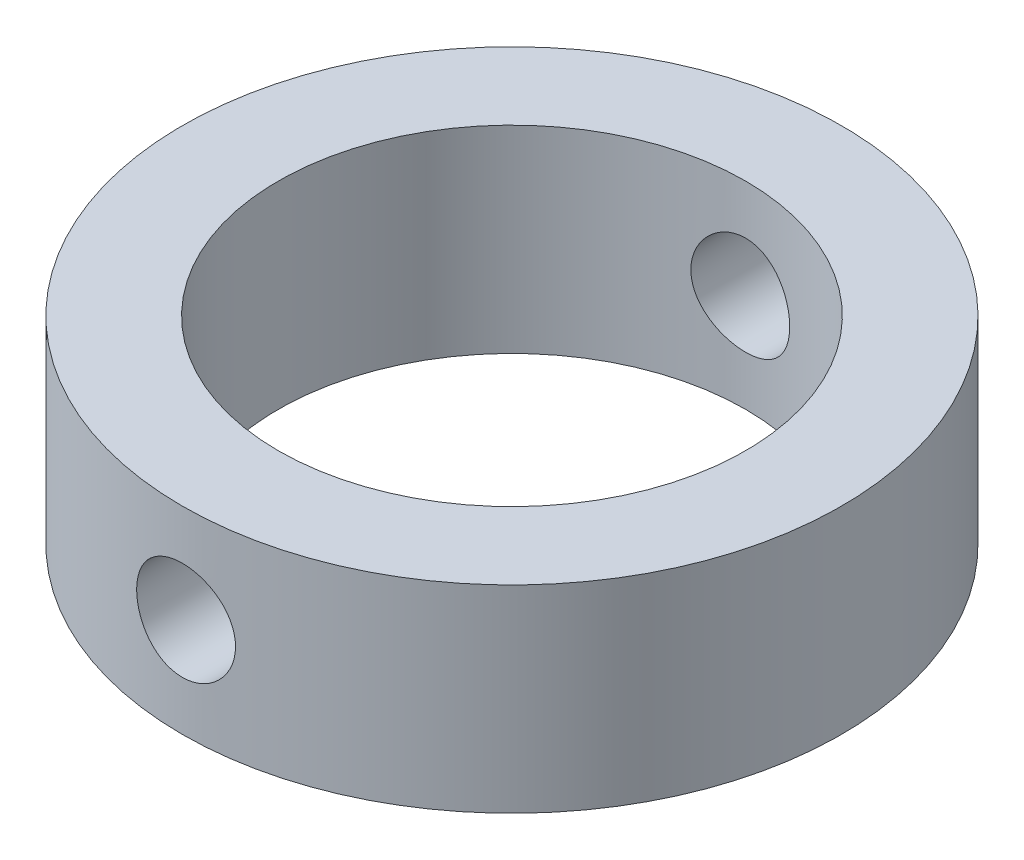
ISO-10303-21;
HEADER;
FILE_DESCRIPTION(('STEP AP214'),'2;1');
FILE_NAME('part.step','',(''),(''),'','','');
FILE_SCHEMA(('AUTOMOTIVE_DESIGN { 1 0 10303 214 1 1 1 1 }'));
ENDSEC;
DATA;
#1=APPLICATION_CONTEXT('core data for automotive mechanical design processes');
#2=APPLICATION_PROTOCOL_DEFINITION('international standard','automotive_design',2000,#1);
#3=PRODUCT_CONTEXT('',#1,'mechanical');
#4=PRODUCT('Part','Part','',(#3));
#5=PRODUCT_RELATED_PRODUCT_CATEGORY('part','',(#4));
#6=PRODUCT_DEFINITION_FORMATION('','',#4);
#7=PRODUCT_DEFINITION_CONTEXT('part definition',#1,'design');
#8=PRODUCT_DEFINITION('design','',#6,#7);
#9=PRODUCT_DEFINITION_SHAPE('','',#8);
#10=(LENGTH_UNIT() NAMED_UNIT(*) SI_UNIT(.MILLI.,.METRE.));
#11=(NAMED_UNIT(*) PLANE_ANGLE_UNIT() SI_UNIT($,.RADIAN.));
#12=(NAMED_UNIT(*) SI_UNIT($,.STERADIAN.) SOLID_ANGLE_UNIT());
#13=UNCERTAINTY_MEASURE_WITH_UNIT(LENGTH_MEASURE(1.E-05),#10,'distance_accuracy_value','');
#14=(GEOMETRIC_REPRESENTATION_CONTEXT(3) GLOBAL_UNCERTAINTY_ASSIGNED_CONTEXT((#13)) GLOBAL_UNIT_ASSIGNED_CONTEXT((#10,
#11,#12)) REPRESENTATION_CONTEXT('',''));
#15=CARTESIAN_POINT('',(0.,0.,0.));
#16=DIRECTION('',(0.,0.,1.));
#17=DIRECTION('',(1.,0.,0.));
#18=AXIS2_PLACEMENT_3D('',#15,#16,#17);
#19=CARTESIAN_POINT('',(0.,7.50000000000001,0.));
#20=DIRECTION('',(0.,1.,0.));
#21=DIRECTION('',(0.,0.,1.));
#22=AXIS2_PLACEMENT_3D('',#19,#20,#21);
#23=PLANE('',#22);
#24=CARTESIAN_POINT('',(0.,7.50000000000001,0.));
#25=DIRECTION('',(0.,1.,0.));
#26=DIRECTION('',(0.,0.,1.));
#27=AXIS2_PLACEMENT_3D('',#24,#25,#26);
#28=CIRCLE('',#27,25.);
#29=CARTESIAN_POINT('',(0.,7.50000000000001,25.));
#30=VERTEX_POINT('',#29);
#31=EDGE_CURVE('E10',#30,#30,#28,.T.);
#32=ORIENTED_EDGE('',*,*,#31,.T.);
#33=EDGE_LOOP('',(#32));
#34=FACE_BOUND('',#33,.T.);
#35=CARTESIAN_POINT('',(0.,7.50000000000001,0.));
#36=DIRECTION('',(0.,1.,0.));
#37=DIRECTION('',(0.,0.,1.));
#38=AXIS2_PLACEMENT_3D('',#35,#36,#37);
#39=CIRCLE('',#38,17.7222);
#40=CARTESIAN_POINT('',(0.,7.50000000000001,17.7222));
#41=VERTEX_POINT('',#40);
#42=EDGE_CURVE('E65',#41,#41,#39,.T.);
#43=ORIENTED_EDGE('',*,*,#42,.F.);
#44=EDGE_LOOP('',(#43));
#45=FACE_BOUND('',#44,.T.);
#46=ADVANCED_FACE('F43',(#34,#45),#23,.T.);
#47=CARTESIAN_POINT('',(0.,-7.50000000000001,0.));
#48=DIRECTION('',(0.,1.,0.));
#49=DIRECTION('',(0.,0.,1.));
#50=AXIS2_PLACEMENT_3D('',#47,#48,#49);
#51=PLANE('',#50);
#52=CARTESIAN_POINT('',(0.,-7.50000000000001,0.));
#53=DIRECTION('',(0.,1.,0.));
#54=DIRECTION('',(0.,0.,1.));
#55=AXIS2_PLACEMENT_3D('',#52,#53,#54);
#56=CIRCLE('',#55,25.);
#57=CARTESIAN_POINT('',(0.,-7.50000000000001,25.));
#58=VERTEX_POINT('',#57);
#59=EDGE_CURVE('E58',#58,#58,#56,.T.);
#60=ORIENTED_EDGE('',*,*,#59,.F.);
#61=EDGE_LOOP('',(#60));
#62=FACE_BOUND('',#61,.T.);
#63=CARTESIAN_POINT('',(0.,-7.50000000000001,0.));
#64=DIRECTION('',(0.,1.,0.));
#65=DIRECTION('',(0.,0.,1.));
#66=AXIS2_PLACEMENT_3D('',#63,#64,#65);
#67=CIRCLE('',#66,17.7222);
#68=CARTESIAN_POINT('',(0.,-7.50000000000001,17.7222));
#69=VERTEX_POINT('',#68);
#70=EDGE_CURVE('E68',#69,#69,#67,.T.);
#71=ORIENTED_EDGE('',*,*,#70,.T.);
#72=EDGE_LOOP('',(#71));
#73=FACE_BOUND('',#72,.T.);
#74=ADVANCED_FACE('F111',(#62,#73),#51,.F.);
#75=CARTESIAN_POINT('',(0.,7.50000000000001,0.));
#76=DIRECTION('',(0.,-1.,0.));
#77=DIRECTION('',(0.,0.,-1.));
#78=AXIS2_PLACEMENT_3D('',#75,#76,#77);
#79=CYLINDRICAL_SURFACE('',#78,25.);
#80=CARTESIAN_POINT('',(0.,3.74999999999998,-25.));
#81=CARTESIAN_POINT('',(-0.209378861204106,3.74999136546187,-24.9999966442824));
#82=CARTESIAN_POINT('',(-0.41887921270533,3.7324049978984,-24.997342063426));
#83=CARTESIAN_POINT('',(-0.832024069987285,3.66254200004314,-24.9870078993297));
#84=CARTESIAN_POINT('',(-1.03566267243558,3.61023159263779,-24.9793234234618));
#85=CARTESIAN_POINT('',(-1.43104521555465,3.47251873758097,-24.9597930304881));
#86=CARTESIAN_POINT('',(-1.62279801956699,3.38714130123514,-24.947950259273));
#87=CARTESIAN_POINT('',(-1.98922607158813,3.18577905145784,-24.9214118977931));
#88=CARTESIAN_POINT('',(-2.16390368681297,3.06979848895659,-24.9067167038193));
#89=CARTESIAN_POINT('',(-2.49261679890531,2.80955683765031,-24.8759792747863));
#90=CARTESIAN_POINT('',(-2.64649958056375,2.66510385947948,-24.8599283472583));
#91=CARTESIAN_POINT('',(-2.92793726672371,2.35243077776534,-24.828356528331));
#92=CARTESIAN_POINT('',(-3.0554906568234,2.18420930805372,-24.8128356674626));
#93=CARTESIAN_POINT('',(-3.28124323749857,1.8277483911938,-24.7839969364681));
#94=CARTESIAN_POINT('',(-3.37929467593011,1.63941438254668,-24.7706902993758));
#95=CARTESIAN_POINT('',(-3.54231580427639,1.24871794838645,-24.7479052826567));
#96=CARTESIAN_POINT('',(-3.60728729722907,1.04635628814029,-24.7384266943862));
#97=CARTESIAN_POINT('',(-3.70182996997278,0.634954895320726,-24.7244564054669));
#98=CARTESIAN_POINT('',(-3.73166259101294,0.425976516479948,-24.7199278935313));
#99=CARTESIAN_POINT('',(-3.75589060084831,0.00593458503179794,-24.7162587242645));
#100=CARTESIAN_POINT('',(-3.75028802434491,-0.205128847156248,-24.7171177575787));
#101=CARTESIAN_POINT('',(-3.70401833126969,-0.621502700485371,-24.7240929588102));
#102=CARTESIAN_POINT('',(-3.66364239819375,-0.826846316212019,-24.7301654690387));
#103=CARTESIAN_POINT('',(-3.54942793509335,-1.22781092217884,-24.7468152031592));
#104=CARTESIAN_POINT('',(-3.4755884584453,-1.42343163720187,-24.7573925544845));
#105=CARTESIAN_POINT('',(-3.29624008824341,-1.80028342820716,-24.781908388637));
#106=CARTESIAN_POINT('',(-3.19060785707994,-1.98145492273098,-24.7958599191632));
#107=CARTESIAN_POINT('',(-2.95076032822386,-2.32361148945484,-24.8255426893637));
#108=CARTESIAN_POINT('',(-2.81654315456195,-2.48459523567344,-24.8412740458125));
#109=CARTESIAN_POINT('',(-2.5217373269562,-2.7834941518493,-24.8729368264052));
#110=CARTESIAN_POINT('',(-2.360898324105,-2.92116247571585,-24.8888686778204));
#111=CARTESIAN_POINT('',(-2.01826772473546,-3.16758983626815,-24.9189911912115));
#112=CARTESIAN_POINT('',(-1.83647603647042,-3.27634874635974,-24.9331818455628));
#113=CARTESIAN_POINT('',(-1.45688649553421,-3.46188271624886,-24.9582378896348));
#114=CARTESIAN_POINT('',(-1.25907919459195,-3.53863872960074,-24.9691012981357));
#115=CARTESIAN_POINT('',(-0.853182956217649,-3.65777347421344,-24.9862622639267));
#116=CARTESIAN_POINT('',(-0.6450947148815,-3.70015452953895,-24.9925601298867));
#117=CARTESIAN_POINT('',(-0.226673919109115,-3.74900807454175,-24.9998395283468));
#118=CARTESIAN_POINT('',(-0.0163818296761745,-3.75581992844831,-25.0008713022597));
#119=CARTESIAN_POINT('',(0.402341694155708,-3.73424248672244,-24.9976390253807));
#120=CARTESIAN_POINT('',(0.610773185954693,-3.70585428082975,-24.9933751385342));
#121=CARTESIAN_POINT('',(1.01883096857852,-3.61496474955615,-24.9800617153833));
#122=CARTESIAN_POINT('',(1.2184949076996,-3.55262875992289,-24.9710353801996));
#123=CARTESIAN_POINT('',(1.6045373966075,-3.39578750634561,-24.9492058914592));
#124=CARTESIAN_POINT('',(1.79091532198775,-3.30128073166592,-24.9364025605391));
#125=CARTESIAN_POINT('',(2.1465874482298,-3.08198443859034,-24.9083170617172));
#126=CARTESIAN_POINT('',(2.31574752472892,-2.95697964996806,-24.8930175406686));
#127=CARTESIAN_POINT('',(2.63080918294427,-2.68053547092813,-24.8616965753041));
#128=CARTESIAN_POINT('',(2.77670941198351,-2.52909454418838,-24.8456750890717));
#129=CARTESIAN_POINT('',(3.04234462392989,-2.20256616705877,-24.8145566076123));
#130=CARTESIAN_POINT('',(3.16185211868553,-2.02729268701307,-24.7994684004397));
#131=CARTESIAN_POINT('',(3.36972823176461,-1.65895989872056,-24.7720804776226));
#132=CARTESIAN_POINT('',(3.4580976914109,-1.46590107119632,-24.7597806866407));
#133=CARTESIAN_POINT('',(3.60083668309858,-1.06815616594216,-24.7394258252161));
#134=CARTESIAN_POINT('',(3.65532592854089,-0.863513847571883,-24.731355825161));
#135=CARTESIAN_POINT('',(3.72913873753966,-0.447852461412236,-24.7203345574451));
#136=CARTESIAN_POINT('',(3.74846472957666,-0.236833835013324,-24.7173829362943));
#137=CARTESIAN_POINT('',(3.751344666736,0.183322658289436,-24.716945815271));
#138=CARTESIAN_POINT('',(3.73525630418282,0.392458104392283,-24.7194056583375));
#139=CARTESIAN_POINT('',(3.66853073860947,0.80501315830877,-24.7293955152794));
#140=CARTESIAN_POINT('',(3.61789359096568,1.00843277528346,-24.7369255210279));
#141=CARTESIAN_POINT('',(3.48363433796663,1.40368270558579,-24.7561881528074));
#142=CARTESIAN_POINT('',(3.40003723310785,1.59552167608359,-24.7679175929019));
#143=CARTESIAN_POINT('',(3.20226669105772,1.96250908450601,-24.7942613639425));
#144=CARTESIAN_POINT('',(3.08809221853755,2.13765695700913,-24.8088757925681));
#145=CARTESIAN_POINT('',(2.83110844147911,2.46810764493795,-24.8395185841234));
#146=CARTESIAN_POINT('',(2.68803422599514,2.62320333311767,-24.8555591970492));
#147=CARTESIAN_POINT('',(2.37787210270709,2.90731138696955,-24.8871447206659));
#148=CARTESIAN_POINT('',(2.21077862087735,3.03631768144039,-24.902689515269));
#149=CARTESIAN_POINT('',(1.8562392688593,3.2652191915184,-24.931629644763));
#150=CARTESIAN_POINT('',(1.6686864419119,3.36495027303686,-24.9450126782205));
#151=CARTESIAN_POINT('',(1.2793796756218,3.53134629189512,-24.968000720074));
#152=CARTESIAN_POINT('',(1.07764069274176,3.59804547513423,-24.9776096391439));
#153=CARTESIAN_POINT('',(0.72916431972332,3.68135335677528,-24.9897734815376));
#154=CARTESIAN_POINT('',(0.584577833738195,3.70705650384704,-24.9935887294889));
#155=CARTESIAN_POINT('',(0.293347429000313,3.7413827442816,-24.9987031486974));
#156=CARTESIAN_POINT('',(0.146703535836043,3.75000604988134,-25.0000023512194));
#157=CARTESIAN_POINT('',(0.,3.74999999999998,-25.));
#158=B_SPLINE_CURVE_WITH_KNOTS('',3,(#80,#81,#82,#83,#84,#85,#86,#87,#88,#89,#90,#91,#92,#93,
#94,#95,#96,#97,#98,#99,#100,#101,#102,#103,#104,#105,#106,#107,#108,#109,#110,#111,#112,#113,
#114,#115,#116,#117,#118,#119,#120,#121,#122,#123,#124,#125,#126,#127,#128,#129,#130,#131,#132,
#133,#134,#135,#136,#137,#138,#139,#140,#141,#142,#143,#144,#145,#146,#147,#148,#149,#150,#151,
#152,#153,#154,#155,#156,#157),.UNSPECIFIED.,.T.,.F.,(4,2,2,2,2,2,2,2,2,2,2,2,2,2,2,2,2,2,2,2,2,
2,2,2,2,2,2,2,2,2,2,2,2,2,2,2,2,2,4),(0.,0.62760051257916,1.25581240732287,1.88355005895809,
2.511200560494,3.14323540342108,3.77530658931448,4.41049255988435,5.04564390563763,
5.67603911514811,6.30639812747458,6.93152942989367,7.55667841725904,8.18428458690398,
8.81193195771337,9.44585728138522,10.0797853809667,10.7140902246219,11.348352179835,
11.9765514636064,12.6047312997789,13.2298787241487,13.8550555094068,14.4847797009227,
15.1145405007157,15.7495341646168,16.3845106702208,17.0172305864292,17.6499068034294,
18.2762222065266,18.9025366057391,19.5283768496037,20.154238286672,20.786120749143,
21.4181500867183,22.0536580846183,22.688505831536,23.1282462994702,23.5679813030823),.UNSPECIFIED.);
#159=CARTESIAN_POINT('',(0.,3.74999999999998,-25.));
#160=VERTEX_POINT('',#159);
#161=EDGE_CURVE('E95',#160,#160,#158,.T.);
#162=ORIENTED_EDGE('',*,*,#161,.T.);
#163=EDGE_LOOP('',(#162));
#164=FACE_BOUND('',#163,.T.);
#165=CARTESIAN_POINT('',(3.75,0.,24.7171499166065));
#166=CARTESIAN_POINT('',(3.74999135268076,-0.209363923243862,24.7171534162569));
#167=CARTESIAN_POINT('',(3.73240740970164,-0.4188493769331,24.7198387912912));
#168=CARTESIAN_POINT('',(3.66255491641441,-0.831963287259849,24.7302828678189));
#169=CARTESIAN_POINT('',(3.61025253506452,-1.03558582871036,24.7380465176796));
#170=CARTESIAN_POINT('',(3.47256315245608,-1.43093438859889,24.757748475261));
#171=CARTESIAN_POINT('',(3.38720154203599,-1.62266940635047,24.7696835784506));
#172=CARTESIAN_POINT('',(3.18587657719372,-1.98906757693512,24.7963798526664));
#173=CARTESIAN_POINT('',(3.06991743574651,-2.16373307553706,24.8111406345481));
#174=CARTESIAN_POINT('',(2.80969756046425,-2.49245954188449,24.8419572312449));
#175=CARTESIAN_POINT('',(2.66524013962059,-2.6463640335165,24.8580215614632));
#176=CARTESIAN_POINT('',(2.35254901361086,-2.9278437141391,24.8895592042144));
#177=CARTESIAN_POINT('',(2.1843140019663,-3.05541745541756,24.9050324842122));
#178=CARTESIAN_POINT('',(1.82784089513188,-3.2811915792283,24.9337336857078));
#179=CARTESIAN_POINT('',(1.63951056841442,-3.37924787580612,24.9469504608901));
#180=CARTESIAN_POINT('',(1.24882212526743,-3.54227899702046,24.9695551686593));
#181=CARTESIAN_POINT('',(1.04646475067669,-3.60725556960723,24.9789433035484));
#182=CARTESIAN_POINT('',(0.635077807726422,-3.70180847132708,24.9927728699448));
#183=CARTESIAN_POINT('',(0.426109710974664,-3.7316468159679,24.9972508971837));
#184=CARTESIAN_POINT('',(0.00608801004869675,-3.75588983706225,25.0008811192395));
#185=CARTESIAN_POINT('',(-0.204965477539366,-3.75029648329923,25.0000336101235));
#186=CARTESIAN_POINT('',(-0.621379295501299,-3.70404165559394,24.9931374915199));
#187=CARTESIAN_POINT('',(-0.826771728500019,-3.66366207052129,24.987130691312));
#188=CARTESIAN_POINT('',(-1.22783207285784,-3.54942348419356,24.9706375056963));
#189=CARTESIAN_POINT('',(-1.42349973378371,-3.4755636212464,24.9601510049935));
#190=CARTESIAN_POINT('',(-1.80040945192579,-3.29617250770726,24.9358048468301));
#191=CARTESIAN_POINT('',(-1.98159418080899,-3.19052258722815,24.921932587891));
#192=CARTESIAN_POINT('',(-2.32376976787545,-2.95063701582503,24.8923609561355));
#193=CARTESIAN_POINT('',(-2.48475929567934,-2.81639948323284,24.8766614630796));
#194=CARTESIAN_POINT('',(-2.78363620680661,-2.52157887793353,24.8450039548157));
#195=CARTESIAN_POINT('',(-2.92128082377367,-2.36074969507472,24.8290449155814));
#196=CARTESIAN_POINT('',(-3.16766498347032,-2.01814730719066,24.7988176113381));
#197=CARTESIAN_POINT('',(-3.27640434819997,-1.83637397320019,24.7845493567412));
#198=CARTESIAN_POINT('',(-3.46192411336512,-1.45679009264838,24.7593193821714));
#199=CARTESIAN_POINT('',(-3.53867955675204,-1.25896716584402,24.7483602461323));
#200=CARTESIAN_POINT('',(-3.65780840522199,-0.853036862131513,24.7310350724765));
#201=CARTESIAN_POINT('',(-3.70018423343315,-0.6449302111331,24.7246687111575));
#202=CARTESIAN_POINT('',(-3.74901800216639,-0.22649977605626,24.7173112848757));
#203=CARTESIAN_POINT('',(-3.75582008162631,-0.0162170294961455,24.7162687200644));
#204=CARTESIAN_POINT('',(-3.73422642549548,0.402485487043363,24.7195401984288));
#205=CARTESIAN_POINT('',(-3.70583178205756,0.610905314626933,24.7238540753945));
#206=CARTESIAN_POINT('',(-3.61494257381915,1.0188995449141,24.7373050615363));
#207=CARTESIAN_POINT('',(-3.55261946319551,1.21851301235403,24.7464179120715));
#208=CARTESIAN_POINT('',(-3.39582079867716,1.60446023012154,24.7684200456442));
#209=CARTESIAN_POINT('',(-3.30134365690972,1.79079332407052,24.7813095151794));
#210=CARTESIAN_POINT('',(-3.08209194988309,2.14643315083763,24.8095338921766));
#211=CARTESIAN_POINT('',(-2.95709461404415,2.31560111819955,24.8248864819997));
#212=CARTESIAN_POINT('',(-2.68066042093003,2.63068214968452,24.8562539858339));
#213=CARTESIAN_POINT('',(-2.52922206861698,2.77659389795286,24.8722689372573));
#214=CARTESIAN_POINT('',(-2.20268904907046,3.04225651658394,24.9033176304347));
#215=CARTESIAN_POINT('',(-2.02740781692989,3.16177932060619,24.9183420865106));
#216=CARTESIAN_POINT('',(-1.6590552006592,3.36968226315661,24.9455726258004));
#217=CARTESIAN_POINT('',(-1.46598430340109,3.45806325366257,24.9577787861141));
#218=CARTESIAN_POINT('',(-1.06824498965286,3.60080935622007,24.9779567415199));
#219=CARTESIAN_POINT('',(-0.863622146885755,3.6552991676959,24.9859440429474));
#220=CARTESIAN_POINT('',(-0.448002038752981,3.72911969884368,24.9968494164225));
#221=CARTESIAN_POINT('',(-0.237005195326448,3.74845274062284,24.9997678232702));
#222=CARTESIAN_POINT('',(0.18316147715204,3.75135426137352,25.0002032264784));
#223=CARTESIAN_POINT('',(0.392328925530112,3.73527170219247,24.9977729255942));
#224=CARTESIAN_POINT('',(0.804949488307786,3.66854652894807,24.9878902629792));
#225=CARTESIAN_POINT('',(1.00840262099135,3.61790402547846,24.9804379173192));
#226=CARTESIAN_POINT('',(1.40372343594909,3.48362031107453,24.9613446685591));
#227=CARTESIAN_POINT('',(1.59559948287171,3.40000326215315,24.9497068329142));
#228=CARTESIAN_POINT('',(1.96265279474175,3.20218128004165,24.9235208623969));
#229=CARTESIAN_POINT('',(2.13782951730268,3.08797535379732,24.9089726330436));
#230=CARTESIAN_POINT('',(2.46828146297899,2.83095575292895,24.878412765869));
#231=CARTESIAN_POINT('',(2.62335516611253,2.68788443546613,24.8623887105156));
#232=CARTESIAN_POINT('',(2.90742020976012,2.37773731729184,24.830775042358));
#233=CARTESIAN_POINT('',(3.03640541998738,2.21065589041309,24.8151855324038));
#234=CARTESIAN_POINT('',(3.26528277056406,1.85612754194085,24.7861121002282));
#235=CARTESIAN_POINT('',(3.36500735723655,1.66857145753498,24.7726405020556));
#236=CARTESIAN_POINT('',(3.53139034675771,1.27925805818213,24.7494727259703));
#237=CARTESIAN_POINT('',(3.59808306436243,1.07751573037934,24.7397726323382));
#238=CARTESIAN_POINT('',(3.68137379725668,0.729056409346079,24.7274871383702));
#239=CARTESIAN_POINT('',(3.70706924451177,0.58449150768439,24.7236312345417));
#240=CARTESIAN_POINT('',(3.74138526441309,0.293304270669045,24.7184614141931));
#241=CARTESIAN_POINT('',(3.75000605837784,0.14668196200793,24.7171474647247));
#242=CARTESIAN_POINT('',(3.75,0.,24.7171499166065));
#243=B_SPLINE_CURVE_WITH_KNOTS('',3,(#165,#166,#167,#168,#169,#170,#171,#172,#173,#174,#175,
#176,#177,#178,#179,#180,#181,#182,#183,#184,#185,#186,#187,#188,#189,#190,#191,#192,#193,#194,
#195,#196,#197,#198,#199,#200,#201,#202,#203,#204,#205,#206,#207,#208,#209,#210,#211,#212,#213,
#214,#215,#216,#217,#218,#219,#220,#221,#222,#223,#224,#225,#226,#227,#228,#229,#230,#231,#232,
#233,#234,#235,#236,#237,#238,#239,#240,#241,#242),.UNSPECIFIED.,.T.,.F.,(4,2,2,2,2,2,2,2,2,2,2,
2,2,2,2,2,2,2,2,2,2,2,2,2,2,2,2,2,2,2,2,2,2,2,2,2,2,2,4),(0.,0.627555629539278,1.25572367395714,
1.88341021339182,2.51101037170595,3.14310396628032,3.77523230524807,4.41039805269719,
5.04553023416515,5.67589581341256,6.30622634853698,6.93149656294584,7.55678287103768,
8.18443290971398,8.81212427378444,9.44598861670937,10.0798568629114,10.7142187943811,
11.3485360111612,11.9767053651462,12.6048552275506,13.229859870237,13.8548953822056,
14.4846371500852,15.1144145365977,15.7494384438905,16.384444976849,17.0171010223299,
17.6497152793145,18.2761240906108,18.9025308973732,19.5284795564985,20.1544485392303,
20.7862737503269,21.4182472559742,22.0537719706901,22.688635086223,23.1283110473742,
23.5679813094887),.UNSPECIFIED.);
#244=CARTESIAN_POINT('',(3.75,0.,24.7171499166065));
#245=VERTEX_POINT('',#244);
#246=EDGE_CURVE('E89',#245,#245,#243,.T.);
#247=ORIENTED_EDGE('',*,*,#246,.T.);
#248=EDGE_LOOP('',(#247));
#249=FACE_BOUND('',#248,.T.);
#250=ORIENTED_EDGE('',*,*,#31,.F.);
#251=EDGE_LOOP('',(#250));
#252=FACE_BOUND('',#251,.T.);
#253=ORIENTED_EDGE('',*,*,#59,.T.);
#254=EDGE_LOOP('',(#253));
#255=FACE_BOUND('',#254,.T.);
#256=ADVANCED_FACE('F45',(#164,#249,#252,#255),#79,.T.);
#257=CARTESIAN_POINT('',(0.,7.50000000000001,0.));
#258=DIRECTION('',(0.,-1.,0.));
#259=DIRECTION('',(0.,0.,-1.));
#260=AXIS2_PLACEMENT_3D('',#257,#258,#259);
#261=CYLINDRICAL_SURFACE('',#260,17.7222);
#262=CARTESIAN_POINT('',(0.,3.74999999999998,-17.7222));
#263=CARTESIAN_POINT('',(-0.208152185255152,3.74999266653267,-17.7221961470917));
#264=CARTESIAN_POINT('',(-0.41639454894016,3.73261053478915,-17.718495379831));
#265=CARTESIAN_POINT('',(-0.82697549267229,3.66360681046194,-17.7040895405869));
#266=CARTESIAN_POINT('',(-1.02930955229037,3.61195968317287,-17.6933792450956));
#267=CARTESIAN_POINT('',(-1.4220797859961,3.47610707502514,-17.6661482075854));
#268=CARTESIAN_POINT('',(-1.612527762323,3.3919345074086,-17.6496333408684));
#269=CARTESIAN_POINT('',(-1.97658898228258,3.1935222719406,-17.6125806048195));
#270=CARTESIAN_POINT('',(-2.15020288067077,3.07928377413531,-17.5920428920488));
#271=CARTESIAN_POINT('',(-2.47829359232655,2.82215911265837,-17.5488523402332));
#272=CARTESIAN_POINT('',(-2.63248026690015,2.67890686784265,-17.5261746803597));
#273=CARTESIAN_POINT('',(-2.91482531722673,2.36860744686158,-17.4814372368369));
#274=CARTESIAN_POINT('',(-3.0429814883738,2.20155825729426,-17.4593775056581));
#275=CARTESIAN_POINT('',(-3.27089013313798,1.84628433118979,-17.4181298435129));
#276=CARTESIAN_POINT('',(-3.37033702804904,1.65785953759665,-17.398973770749));
#277=CARTESIAN_POINT('',(-3.53604503663322,1.26650138054312,-17.3660571970979));
#278=CARTESIAN_POINT('',(-3.60230984632562,1.06356963583257,-17.3522960953235));
#279=CARTESIAN_POINT('',(-3.69882038915951,0.652095534338813,-17.3319797145479));
#280=CARTESIAN_POINT('',(-3.72957803284,0.44367840257558,-17.325322132504));
#281=CARTESIAN_POINT('',(-3.75579222040198,0.0245439529289904,-17.3196590845325));
#282=CARTESIAN_POINT('',(-3.75125281635522,-0.186173098152194,-17.3206527402489));
#283=CARTESIAN_POINT('',(-3.70741447312024,-0.600144024076815,-17.3300871453066));
#284=CARTESIAN_POINT('',(-3.66870712250094,-0.803463870180767,-17.3384011430383));
#285=CARTESIAN_POINT('',(-3.55856755059544,-1.20065708434444,-17.3613393781391));
#286=CARTESIAN_POINT('',(-3.48713359938168,-1.39452995243762,-17.3759639490826));
#287=CARTESIAN_POINT('',(-3.3130169457595,-1.76900525558975,-17.4100022405893));
#288=CARTESIAN_POINT('',(-3.21010404075646,-1.94949733471914,-17.4294510352031));
#289=CARTESIAN_POINT('',(-2.97611287763404,-2.29087060233029,-17.4709244872574));
#290=CARTESIAN_POINT('',(-2.84503101428523,-2.45174927643813,-17.4929494742497));
#291=CARTESIAN_POINT('',(-2.55527727463654,-2.75273797748361,-17.5376395639383));
#292=CARTESIAN_POINT('',(-2.39610160950076,-2.89236288513993,-17.5603086103753));
#293=CARTESIAN_POINT('',(-2.05634155221086,-3.14301199068524,-17.6033266007612));
#294=CARTESIAN_POINT('',(-1.87575681901751,-3.25403573287791,-17.6236755077411));
#295=CARTESIAN_POINT('',(-1.49773346902194,-3.44443897454558,-17.6598199907713));
#296=CARTESIAN_POINT('',(-1.30026354782879,-3.5237580802098,-17.6756068609576));
#297=CARTESIAN_POINT('',(-0.894390959853441,-3.64795660986314,-17.7007833304223));
#298=CARTESIAN_POINT('',(-0.685989782919562,-3.69284071412211,-17.7101737990549));
#299=CARTESIAN_POINT('',(-0.268334585437967,-3.74619689441788,-17.7213767146153));
#300=CARTESIAN_POINT('',(-0.0591688756376419,-3.75533211518441,-17.7233271572078));
#301=CARTESIAN_POINT('',(0.357699882223733,-3.7387241455296,-17.7198156294982));
#302=CARTESIAN_POINT('',(0.565403021980799,-3.71298316160336,-17.7143541281237));
#303=CARTESIAN_POINT('',(0.971276090111958,-3.62790381593627,-17.6967191722838));
#304=CARTESIAN_POINT('',(1.16952157037204,-3.56891032691673,-17.6846146482463));
#305=CARTESIAN_POINT('',(1.55330482716889,-3.41938105298411,-17.6550473164882));
#306=CARTESIAN_POINT('',(1.73884156867098,-3.32884270261685,-17.6375840729719));
#307=CARTESIAN_POINT('',(2.09470415857252,-3.11739146103108,-17.5988945431411));
#308=CARTESIAN_POINT('',(2.26479098769048,-2.99608521007218,-17.5776206615175));
#309=CARTESIAN_POINT('',(2.5824324460133,-2.72706296083509,-17.5337723095124));
#310=CARTESIAN_POINT('',(2.72998434524564,-2.57934376748426,-17.5111976820089));
#311=CARTESIAN_POINT('',(3.00096508318142,-2.25865490461321,-17.4668199433546));
#312=CARTESIAN_POINT('',(3.12393621131072,-2.08529522089939,-17.4450367352952));
#313=CARTESIAN_POINT('',(3.33901833475105,-1.7199930120902,-17.4051527897));
#314=CARTESIAN_POINT('',(3.43113063232395,-1.52805127160994,-17.3870518967809));
#315=CARTESIAN_POINT('',(3.5812796624344,-1.13204333544177,-17.3567474486069));
#316=CARTESIAN_POINT('',(3.63950291210935,-0.928050444144708,-17.3445116801737));
#317=CARTESIAN_POINT('',(3.72077563508814,-0.512886650899571,-17.3272605713025));
#318=CARTESIAN_POINT('',(3.74383032158951,-0.301716817567705,-17.3222441607122));
#319=CARTESIAN_POINT('',(3.75390077642337,0.117199436329279,-17.3200640777949));
#320=CARTESIAN_POINT('',(3.74164125208719,0.324927945921498,-17.3227424916424));
#321=CARTESIAN_POINT('',(3.6830433466586,0.735288357102404,-17.3352948169723));
#322=CARTESIAN_POINT('',(3.63670531509406,0.937920310942116,-17.3451686546543));
#323=CARTESIAN_POINT('',(3.51160559451979,1.33180466845612,-17.3709247713923));
#324=CARTESIAN_POINT('',(3.43294291003997,1.52308979591756,-17.3867886919825));
#325=CARTESIAN_POINT('',(3.2455143852809,1.88985734059801,-17.4227459150073));
#326=CARTESIAN_POINT('',(3.13674564350965,2.06533823251138,-17.4428396250459));
#327=CARTESIAN_POINT('',(2.88976091302207,2.39910281812074,-17.4854685786902));
#328=CARTESIAN_POINT('',(2.75102571999953,2.55699738504185,-17.5080428894493));
#329=CARTESIAN_POINT('',(2.44910638381815,2.84750315660893,-17.5528201552829));
#330=CARTESIAN_POINT('',(2.28591661359643,2.98010852614178,-17.5750230235769));
#331=CARTESIAN_POINT('',(1.93736830904406,3.21778392758599,-17.6168703527083));
#332=CARTESIAN_POINT('',(1.75176776880861,3.32250531498017,-17.6364810034619));
#333=CARTESIAN_POINT('',(1.36522969361138,3.49910204168294,-17.6705978681026));
#334=CARTESIAN_POINT('',(1.16430557538415,3.57100573817274,-17.6851084863342));
#335=CARTESIAN_POINT('',(0.802566208000677,3.66667443463992,-17.7047108510407));
#336=CARTESIAN_POINT('',(0.643749678729262,3.69786345280609,-17.7112295441063));
#337=CARTESIAN_POINT('',(0.323306828576754,3.73952867830156,-17.7199755309738));
#338=CARTESIAN_POINT('',(0.16168061790495,3.75000569621462,-17.722202992717));
#339=CARTESIAN_POINT('',(0.,3.74999999999998,-17.7222));
#340=B_SPLINE_CURVE_WITH_KNOTS('',3,(#262,#263,#264,#265,#266,#267,#268,#269,#270,#271,#272,
#273,#274,#275,#276,#277,#278,#279,#280,#281,#282,#283,#284,#285,#286,#287,#288,#289,#290,#291,
#292,#293,#294,#295,#296,#297,#298,#299,#300,#301,#302,#303,#304,#305,#306,#307,#308,#309,#310,
#311,#312,#313,#314,#315,#316,#317,#318,#319,#320,#321,#322,#323,#324,#325,#326,#327,#328,#329,
#330,#331,#332,#333,#334,#335,#336,#337,#338,#339),.UNSPECIFIED.,.T.,.F.,(4,2,2,2,2,2,2,2,2,2,2,
2,2,2,2,2,2,2,2,2,2,2,2,2,2,2,2,2,2,2,2,2,2,2,2,2,2,2,4),(0.,0.623864874495568,1.24819518393421,
1.87189536666159,2.49557128105162,3.12767066593478,3.7598235630179,4.39847591563496,
5.0370571154976,5.66631208782473,6.29549482327059,6.91399290307351,7.53252368044719,
8.1556904691464,8.77893706195789,9.41477203996356,10.0506171479673,10.687667763103,
11.3246317774797,11.9497224253038,12.5747735276825,13.1934582426495,13.81219328524,
14.4392769101839,15.0664364424179,15.7043646908095,16.3422660148394,16.976622450319,
17.6108848430917,18.2322244050554,18.8535575943087,19.473001771584,20.0925056690176,
20.7237549900906,21.3551497869745,21.9941033399093,22.6325037343333,23.1171049698507,
23.6016872396644),.UNSPECIFIED.);
#341=CARTESIAN_POINT('',(0.,3.74999999999998,-17.7222));
#342=VERTEX_POINT('',#341);
#343=EDGE_CURVE('E48',#342,#342,#340,.T.);
#344=ORIENTED_EDGE('',*,*,#343,.F.);
#345=EDGE_LOOP('',(#344));
#346=FACE_BOUND('',#345,.T.);
#347=CARTESIAN_POINT('',(3.75,0.,17.3209085454545));
#348=CARTESIAN_POINT('',(3.74999262317846,-0.208093377559216,17.3209127403599));
#349=CARTESIAN_POINT('',(3.73261997860774,-0.41627704426552,17.3246994128075));
#350=CARTESIAN_POINT('',(3.66365734999549,-0.82673613295852,17.3394113210448));
#351=CARTESIAN_POINT('',(3.61204159866975,-1.02900698590625,17.35034193242));
#352=CARTESIAN_POINT('',(3.47628071020747,-1.42164331670556,17.378049597833));
#353=CARTESIAN_POINT('',(3.3921699578918,-1.61202113271457,17.3948204701126));
#354=CARTESIAN_POINT('',(3.19390346373044,-1.97596394029922,17.4323116003607));
#355=CARTESIAN_POINT('',(3.07974875129999,-2.14952950764491,17.4530317230068));
#356=CARTESIAN_POINT('',(2.8227102243032,-2.47767122093244,17.4964528436146));
#357=CARTESIAN_POINT('',(2.67944149998641,-2.63194274311314,17.5191777906157));
#358=CARTESIAN_POINT('',(2.36907303755115,-2.9144525696,17.5638379340189));
#359=CARTESIAN_POINT('',(2.20197152130571,-3.04268892973225,17.5857730713415));
#360=CARTESIAN_POINT('',(1.84664821708077,-3.27068435862293,17.6266419499506));
#361=CARTESIAN_POINT('',(1.65823536178029,-3.37015179600751,17.6455441445425));
#362=CARTESIAN_POINT('',(1.26690298543268,-3.53590103120925,17.6779474301966));
#363=CARTESIAN_POINT('',(1.06398498883088,-3.60218631052539,17.6914490878576));
#364=CARTESIAN_POINT('',(0.652567580719959,-3.69873534853722,17.7113608065571));
#365=CARTESIAN_POINT('',(0.444194041340712,-3.7295142314838,17.7178721830305));
#366=CARTESIAN_POINT('',(0.0251460275708574,-3.75578602313321,17.7234202773815));
#367=CARTESIAN_POINT('',(-0.185528197367947,-3.75128272010942,17.7224577977324));
#368=CARTESIAN_POINT('',(-0.599650668847661,-3.70750438089793,17.7132444762233));
#369=CARTESIAN_POINT('',(-0.803160564023222,-3.66878443670728,17.7051099896601));
#370=CARTESIAN_POINT('',(-1.20072724293188,-3.55855488407318,17.6825986819167));
#371=CARTESIAN_POINT('',(-1.39478361731767,-3.48704385713527,17.668221590692));
#372=CARTESIAN_POINT('',(-1.76949226205794,-3.31276204154235,17.6346515461538));
#373=CARTESIAN_POINT('',(-1.95004234186693,-3.20977809359904,17.6154259149491));
#374=CARTESIAN_POINT('',(-2.2915020832145,-2.97563223175987,17.574271331142));
#375=CARTESIAN_POINT('',(-2.45240922613981,-2.84446671036701,17.552342032599));
#376=CARTESIAN_POINT('',(-2.75331424766758,-2.5546498054732,17.5076914056489));
#377=CARTESIAN_POINT('',(-2.89284352514332,-2.3955125821641,17.4849629705469));
#378=CARTESIAN_POINT('',(-3.14331748073308,-2.05586476772887,17.4416780316321));
#379=CARTESIAN_POINT('',(-3.25426148100089,-1.87535366990952,17.4211215793306));
#380=CARTESIAN_POINT('',(-3.44460544567757,-1.4973577262115,17.3844910940221));
#381=CARTESIAN_POINT('',(-3.52392183288319,-1.29982956327181,17.3684289703895));
#382=CARTESIAN_POINT('',(-3.64809745225986,-0.893829338665766,17.3427742763144));
#383=CARTESIAN_POINT('',(-3.69296176518216,-0.68535889553681,17.3331807519537));
#384=CARTESIAN_POINT('',(-3.74624324397612,-0.267660091110112,17.321742710072));
#385=CARTESIAN_POINT('',(-3.75534053082154,-0.0585223454091618,17.3197536124913));
#386=CARTESIAN_POINT('',(-3.73866669739234,0.358281689094897,17.3233603789464));
#387=CARTESIAN_POINT('',(-3.71289780756497,0.565948071169309,17.3289557577907));
#388=CARTESIAN_POINT('',(-3.62781175603405,0.971578538198272,17.3469649281265));
#389=CARTESIAN_POINT('',(-3.56886480360998,1.1696239282128,17.3593034347226));
#390=CARTESIAN_POINT('',(-3.41949479846595,1.55302736673519,17.3893414522287));
#391=CARTESIAN_POINT('',(-3.32906889399048,1.73838426394022,17.4070414488305));
#392=CARTESIAN_POINT('',(-3.11779340887312,2.09410517830178,17.4461285497627));
#393=CARTESIAN_POINT('',(-2.99652228144575,2.26421325550393,17.467565329004));
#394=CARTESIAN_POINT('',(-2.72755439164383,2.58191367667266,17.5115775650937));
#395=CARTESIAN_POINT('',(-2.57985456808567,2.72950340871106,17.5341531536303));
#396=CARTESIAN_POINT('',(-2.25915377249306,3.000593538018,17.5783730388198));
#397=CARTESIAN_POINT('',(-2.08575840667883,3.12363173147599,17.5999943920104));
#398=CARTESIAN_POINT('',(-1.72036426394338,3.33883143800125,17.6394568181403));
#399=CARTESIAN_POINT('',(-1.52836632473975,3.43099434062302,17.6572980611917));
#400=CARTESIAN_POINT('',(-1.13237181293257,3.58117182698285,17.6870928075675));
#401=CARTESIAN_POINT('',(-0.928456948272547,3.63939444068021,17.6990821038446));
#402=CARTESIAN_POINT('',(-0.513459944970105,3.7206922216256,17.7159763748215));
#403=CARTESIAN_POINT('',(-0.302378782011162,3.74377215404811,17.7208823099854));
#404=CARTESIAN_POINT('',(0.116560832719898,3.75392671639739,17.7230308401985));
#405=CARTESIAN_POINT('',(0.324402062843804,3.74169327597626,17.7204207074236));
#406=CARTESIAN_POINT('',(0.734994933660259,3.6831082704523,17.7081436067736));
#407=CARTESIAN_POINT('',(0.937746654628523,3.63675724382879,17.698476750275));
#408=CARTESIAN_POINT('',(1.33191041798982,3.51157522396491,17.6731806640817));
#409=CARTESIAN_POINT('',(1.52335293699509,3.43283654961418,17.6575683907202));
#410=CARTESIAN_POINT('',(1.89040430753438,3.24520668754175,17.6220539549752));
#411=CARTESIAN_POINT('',(2.066011728651,3.13631277944471,17.6021514055916));
#412=CARTESIAN_POINT('',(2.39980151247036,2.88917687962351,17.5597884397093));
#413=CARTESIAN_POINT('',(2.55761616742306,2.75044494942397,17.5372886507353));
#414=CARTESIAN_POINT('',(2.84796223724989,2.44856669830367,17.4924874475652));
#415=CARTESIAN_POINT('',(2.98048759586126,2.28541454589567,17.4701860821035));
#416=CARTESIAN_POINT('',(3.21805989106317,1.93690896749649,17.4280016019896));
#417=CARTESIAN_POINT('',(3.32274774875285,1.75130653135795,17.408151706626));
#418=CARTESIAN_POINT('',(3.49928129047303,1.36476790591703,17.3735304123889));
#419=CARTESIAN_POINT('',(3.57115555676738,1.16384524003873,17.3587545965321));
#420=CARTESIAN_POINT('',(3.6667550315034,0.802180592249884,17.3387719502576));
#421=CARTESIAN_POINT('',(3.69791362140267,0.643441629825071,17.3321164661325));
#422=CARTESIAN_POINT('',(3.73953852764503,0.323153182302085,17.3231832284598));
#423=CARTESIAN_POINT('',(3.75000572878646,0.161603817679431,17.3209052877212));
#424=CARTESIAN_POINT('',(3.75,0.,17.3209085454545));
#425=B_SPLINE_CURVE_WITH_KNOTS('',3,(#347,#348,#349,#350,#351,#352,#353,#354,#355,#356,#357,
#358,#359,#360,#361,#362,#363,#364,#365,#366,#367,#368,#369,#370,#371,#372,#373,#374,#375,#376,
#377,#378,#379,#380,#381,#382,#383,#384,#385,#386,#387,#388,#389,#390,#391,#392,#393,#394,#395,
#396,#397,#398,#399,#400,#401,#402,#403,#404,#405,#406,#407,#408,#409,#410,#411,#412,#413,#414,
#415,#416,#417,#418,#419,#420,#421,#422,#423,#424),.UNSPECIFIED.,.T.,.F.,(4,2,2,2,2,2,2,2,2,2,2,
2,2,2,2,2,2,2,2,2,2,2,2,2,2,2,2,2,2,2,2,2,2,2,2,2,2,2,4),(0.,0.623688090543528,1.24784602759235,
1.87134530840723,2.49482322865155,3.12715391539679,3.75953180403848,4.39811185432497,
5.03662489022361,5.66575306846345,6.29481369768978,6.91385275136084,7.53291858628582,
8.15627379990392,8.77970885623474,9.41529368384851,10.0508935817771,10.6881621200715,
11.3253366603958,11.9503347936719,12.5752929466693,13.1934120958477,13.8115872565353,
14.4387129619278,15.0659113531267,15.7039879007302,16.3420357275908,16.9761304972284,
17.6101392790794,18.2318101300843,18.853471169442,19.4733723505521,20.0933294726496,
20.7243716110697,21.3555646818814,21.9945428733454,22.6329634162214,23.1173358066245,
23.6016874840072),.UNSPECIFIED.);
#426=CARTESIAN_POINT('',(3.75,0.,17.3209085454545));
#427=VERTEX_POINT('',#426);
#428=EDGE_CURVE('E70',#427,#427,#425,.T.);
#429=ORIENTED_EDGE('',*,*,#428,.F.);
#430=EDGE_LOOP('',(#429));
#431=FACE_BOUND('',#430,.T.);
#432=ORIENTED_EDGE('',*,*,#42,.T.);
#433=EDGE_LOOP('',(#432));
#434=FACE_BOUND('',#433,.T.);
#435=ORIENTED_EDGE('',*,*,#70,.F.);
#436=EDGE_LOOP('',(#435));
#437=FACE_BOUND('',#436,.T.);
#438=ADVANCED_FACE('F76',(#346,#431,#434,#437),#261,.F.);
#439=CARTESIAN_POINT('',(0.,0.,-25.));
#440=DIRECTION('',(0.,0.,1.));
#441=DIRECTION('',(1.,0.,0.));
#442=AXIS2_PLACEMENT_3D('',#439,#440,#441);
#443=CYLINDRICAL_SURFACE('',#442,3.75);
#444=ORIENTED_EDGE('',*,*,#428,.T.);
#445=EDGE_LOOP('',(#444));
#446=FACE_BOUND('',#445,.T.);
#447=ORIENTED_EDGE('',*,*,#246,.F.);
#448=EDGE_LOOP('',(#447));
#449=FACE_BOUND('',#448,.T.);
#450=ADVANCED_FACE('F82',(#446,#449),#443,.F.);
#451=ORIENTED_EDGE('',*,*,#343,.T.);
#452=EDGE_LOOP('',(#451));
#453=FACE_BOUND('',#452,.T.);
#454=ORIENTED_EDGE('',*,*,#161,.F.);
#455=EDGE_LOOP('',(#454));
#456=FACE_BOUND('',#455,.T.);
#457=ADVANCED_FACE('F79',(#453,#456),#443,.F.);
#458=CLOSED_SHELL('',(#46,#74,#256,#438,#450,#457));
#459=MANIFOLD_SOLID_BREP('B2',#458);
#460=ADVANCED_BREP_SHAPE_REPRESENTATION('',(#18,#459),#14);
#461=SHAPE_DEFINITION_REPRESENTATION(#9,#460);
ENDSEC;
END-ISO-10303-21;
